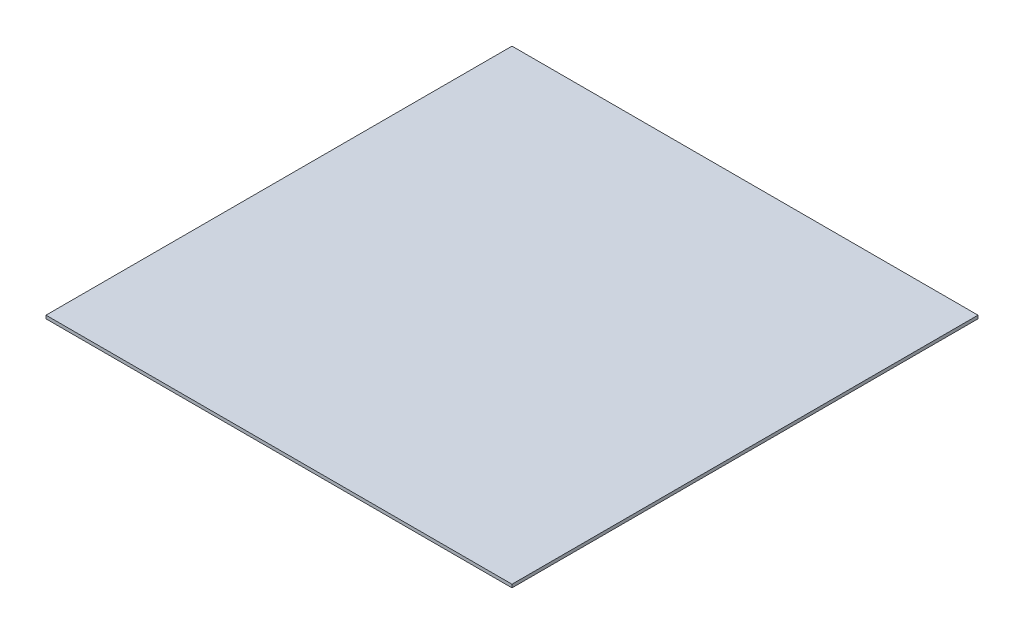
ISO-10303-21;
HEADER;
FILE_DESCRIPTION(('STEP AP214'),'2;1');
FILE_NAME('part.step','',(''),(''),'','','');
FILE_SCHEMA(('AUTOMOTIVE_DESIGN { 1 0 10303 214 1 1 1 1 }'));
ENDSEC;
DATA;
#1=APPLICATION_CONTEXT('core data for automotive mechanical design processes');
#2=APPLICATION_PROTOCOL_DEFINITION('international standard','automotive_design',2000,#1);
#3=PRODUCT_CONTEXT('',#1,'mechanical');
#4=PRODUCT('Part','Part','',(#3));
#5=PRODUCT_RELATED_PRODUCT_CATEGORY('part','',(#4));
#6=PRODUCT_DEFINITION_FORMATION('','',#4);
#7=PRODUCT_DEFINITION_CONTEXT('part definition',#1,'design');
#8=PRODUCT_DEFINITION('design','',#6,#7);
#9=PRODUCT_DEFINITION_SHAPE('','',#8);
#10=(LENGTH_UNIT() NAMED_UNIT(*) SI_UNIT(.MILLI.,.METRE.));
#11=(NAMED_UNIT(*) PLANE_ANGLE_UNIT() SI_UNIT($,.RADIAN.));
#12=(NAMED_UNIT(*) SI_UNIT($,.STERADIAN.) SOLID_ANGLE_UNIT());
#13=UNCERTAINTY_MEASURE_WITH_UNIT(LENGTH_MEASURE(1.E-05),#10,'distance_accuracy_value','');
#14=(GEOMETRIC_REPRESENTATION_CONTEXT(3) GLOBAL_UNCERTAINTY_ASSIGNED_CONTEXT((#13)) GLOBAL_UNIT_ASSIGNED_CONTEXT((#10,
#11,#12)) REPRESENTATION_CONTEXT('',''));
#15=CARTESIAN_POINT('',(0.,0.,0.));
#16=DIRECTION('',(0.,0.,1.));
#17=DIRECTION('',(1.,0.,0.));
#18=AXIS2_PLACEMENT_3D('',#15,#16,#17);
#19=CARTESIAN_POINT('',(15.,0.206,-15.));
#20=DIRECTION('',(-1.,0.,0.));
#21=DIRECTION('',(0.,0.,1.));
#22=AXIS2_PLACEMENT_3D('',#19,#20,#21);
#23=PLANE('',#22);
#24=DIRECTION('',(0.,0.,-1.));
#25=VECTOR('',#24,1.);
#26=CARTESIAN_POINT('',(15.,0.,-15.));
#27=LINE('',#26,#25);
#28=CARTESIAN_POINT('',(15.,0.,15.));
#29=VERTEX_POINT('',#28);
#30=CARTESIAN_POINT('',(15.,0.,-15.));
#31=VERTEX_POINT('',#30);
#32=EDGE_CURVE('E110',#29,#31,#27,.T.);
#33=ORIENTED_EDGE('',*,*,#32,.T.);
#34=DIRECTION('',(0.,-1.,0.));
#35=VECTOR('',#34,1.);
#36=CARTESIAN_POINT('',(15.,0.206,-15.));
#37=LINE('',#36,#35);
#38=CARTESIAN_POINT('',(15.,0.206,-15.));
#39=VERTEX_POINT('',#38);
#40=EDGE_CURVE('E11',#39,#31,#37,.T.);
#41=ORIENTED_EDGE('',*,*,#40,.F.);
#42=DIRECTION('',(0.,0.,-1.));
#43=VECTOR('',#42,1.);
#44=CARTESIAN_POINT('',(15.,0.206,-15.));
#45=LINE('',#44,#43);
#46=CARTESIAN_POINT('',(15.,0.206,15.));
#47=VERTEX_POINT('',#46);
#48=EDGE_CURVE('E98',#47,#39,#45,.T.);
#49=ORIENTED_EDGE('',*,*,#48,.F.);
#50=DIRECTION('',(0.,-1.,0.));
#51=VECTOR('',#50,1.);
#52=CARTESIAN_POINT('',(15.,0.206,15.));
#53=LINE('',#52,#51);
#54=EDGE_CURVE('E106',#47,#29,#53,.T.);
#55=ORIENTED_EDGE('',*,*,#54,.T.);
#56=EDGE_LOOP('',(#33,#41,#49,#55));
#57=FACE_BOUND('',#56,.T.);
#58=ADVANCED_FACE('F47',(#57),#23,.F.);
#59=CARTESIAN_POINT('',(-15.,0.206,-15.));
#60=DIRECTION('',(0.,0.,1.));
#61=DIRECTION('',(1.,0.,0.));
#62=AXIS2_PLACEMENT_3D('',#59,#60,#61);
#63=PLANE('',#62);
#64=DIRECTION('',(-1.,0.,0.));
#65=VECTOR('',#64,1.);
#66=CARTESIAN_POINT('',(-15.,0.,-15.));
#67=LINE('',#66,#65);
#68=CARTESIAN_POINT('',(-15.,0.,-15.));
#69=VERTEX_POINT('',#68);
#70=EDGE_CURVE('E102',#31,#69,#67,.T.);
#71=ORIENTED_EDGE('',*,*,#70,.T.);
#72=DIRECTION('',(0.,-1.,0.));
#73=VECTOR('',#72,1.);
#74=CARTESIAN_POINT('',(-15.,0.206,-15.));
#75=LINE('',#74,#73);
#76=CARTESIAN_POINT('',(-15.,0.206,-15.));
#77=VERTEX_POINT('',#76);
#78=EDGE_CURVE('E55',#77,#69,#75,.T.);
#79=ORIENTED_EDGE('',*,*,#78,.F.);
#80=DIRECTION('',(-1.,0.,0.));
#81=VECTOR('',#80,1.);
#82=CARTESIAN_POINT('',(-15.,0.206,-15.));
#83=LINE('',#82,#81);
#84=EDGE_CURVE('E93',#39,#77,#83,.T.);
#85=ORIENTED_EDGE('',*,*,#84,.F.);
#86=ORIENTED_EDGE('',*,*,#40,.T.);
#87=EDGE_LOOP('',(#71,#79,#85,#86));
#88=FACE_BOUND('',#87,.T.);
#89=ADVANCED_FACE('F101',(#88),#63,.F.);
#90=CARTESIAN_POINT('',(-15.,0.206,-15.));
#91=DIRECTION('',(1.,0.,0.));
#92=DIRECTION('',(0.,0.,-1.));
#93=AXIS2_PLACEMENT_3D('',#90,#91,#92);
#94=PLANE('',#93);
#95=DIRECTION('',(0.,0.,1.));
#96=VECTOR('',#95,1.);
#97=CARTESIAN_POINT('',(-15.,0.,-15.));
#98=LINE('',#97,#96);
#99=CARTESIAN_POINT('',(-15.,0.,15.));
#100=VERTEX_POINT('',#99);
#101=EDGE_CURVE('E80',#69,#100,#98,.T.);
#102=ORIENTED_EDGE('',*,*,#101,.T.);
#103=DIRECTION('',(0.,-1.,0.));
#104=VECTOR('',#103,1.);
#105=CARTESIAN_POINT('',(-15.,0.206,15.));
#106=LINE('',#105,#104);
#107=CARTESIAN_POINT('',(-15.,0.206,15.));
#108=VERTEX_POINT('',#107);
#109=EDGE_CURVE('E103',#108,#100,#106,.T.);
#110=ORIENTED_EDGE('',*,*,#109,.F.);
#111=DIRECTION('',(0.,0.,1.));
#112=VECTOR('',#111,1.);
#113=CARTESIAN_POINT('',(-15.,0.206,-15.));
#114=LINE('',#113,#112);
#115=EDGE_CURVE('E96',#77,#108,#114,.T.);
#116=ORIENTED_EDGE('',*,*,#115,.F.);
#117=ORIENTED_EDGE('',*,*,#78,.T.);
#118=EDGE_LOOP('',(#102,#110,#116,#117));
#119=FACE_BOUND('',#118,.T.);
#120=ADVANCED_FACE('F104',(#119),#94,.F.);
#121=CARTESIAN_POINT('',(-15.,0.206,15.));
#122=DIRECTION('',(0.,0.,-1.));
#123=DIRECTION('',(-1.,0.,0.));
#124=AXIS2_PLACEMENT_3D('',#121,#122,#123);
#125=PLANE('',#124);
#126=DIRECTION('',(1.,0.,0.));
#127=VECTOR('',#126,1.);
#128=CARTESIAN_POINT('',(-15.,0.,15.));
#129=LINE('',#128,#127);
#130=EDGE_CURVE('E86',#100,#29,#129,.T.);
#131=ORIENTED_EDGE('',*,*,#130,.T.);
#132=ORIENTED_EDGE('',*,*,#54,.F.);
#133=DIRECTION('',(1.,0.,0.));
#134=VECTOR('',#133,1.);
#135=CARTESIAN_POINT('',(-15.,0.206,15.));
#136=LINE('',#135,#134);
#137=EDGE_CURVE('E63',#108,#47,#136,.T.);
#138=ORIENTED_EDGE('',*,*,#137,.F.);
#139=ORIENTED_EDGE('',*,*,#109,.T.);
#140=EDGE_LOOP('',(#131,#132,#138,#139));
#141=FACE_BOUND('',#140,.T.);
#142=ADVANCED_FACE('F117',(#141),#125,.F.);
#143=CARTESIAN_POINT('',(0.,0.206,0.));
#144=DIRECTION('',(0.,1.,0.));
#145=DIRECTION('',(0.,0.,1.));
#146=AXIS2_PLACEMENT_3D('',#143,#144,#145);
#147=PLANE('',#146);
#148=ORIENTED_EDGE('',*,*,#48,.T.);
#149=ORIENTED_EDGE('',*,*,#84,.T.);
#150=ORIENTED_EDGE('',*,*,#115,.T.);
#151=ORIENTED_EDGE('',*,*,#137,.T.);
#152=EDGE_LOOP('',(#148,#149,#150,#151));
#153=FACE_BOUND('',#152,.T.);
#154=ADVANCED_FACE('F94',(#153),#147,.T.);
#155=CARTESIAN_POINT('',(0.,0.,0.));
#156=DIRECTION('',(0.,1.,0.));
#157=DIRECTION('',(0.,0.,1.));
#158=AXIS2_PLACEMENT_3D('',#155,#156,#157);
#159=PLANE('',#158);
#160=ORIENTED_EDGE('',*,*,#32,.F.);
#161=ORIENTED_EDGE('',*,*,#130,.F.);
#162=ORIENTED_EDGE('',*,*,#101,.F.);
#163=ORIENTED_EDGE('',*,*,#70,.F.);
#164=EDGE_LOOP('',(#160,#161,#162,#163));
#165=FACE_BOUND('',#164,.T.);
#166=ADVANCED_FACE('F120',(#165),#159,.F.);
#167=CLOSED_SHELL('',(#58,#89,#120,#142,#154,#166));
#168=MANIFOLD_SOLID_BREP('B2',#167);
#169=ADVANCED_BREP_SHAPE_REPRESENTATION('',(#18,#168),#14);
#170=SHAPE_DEFINITION_REPRESENTATION(#9,#169);
ENDSEC;
END-ISO-10303-21;
